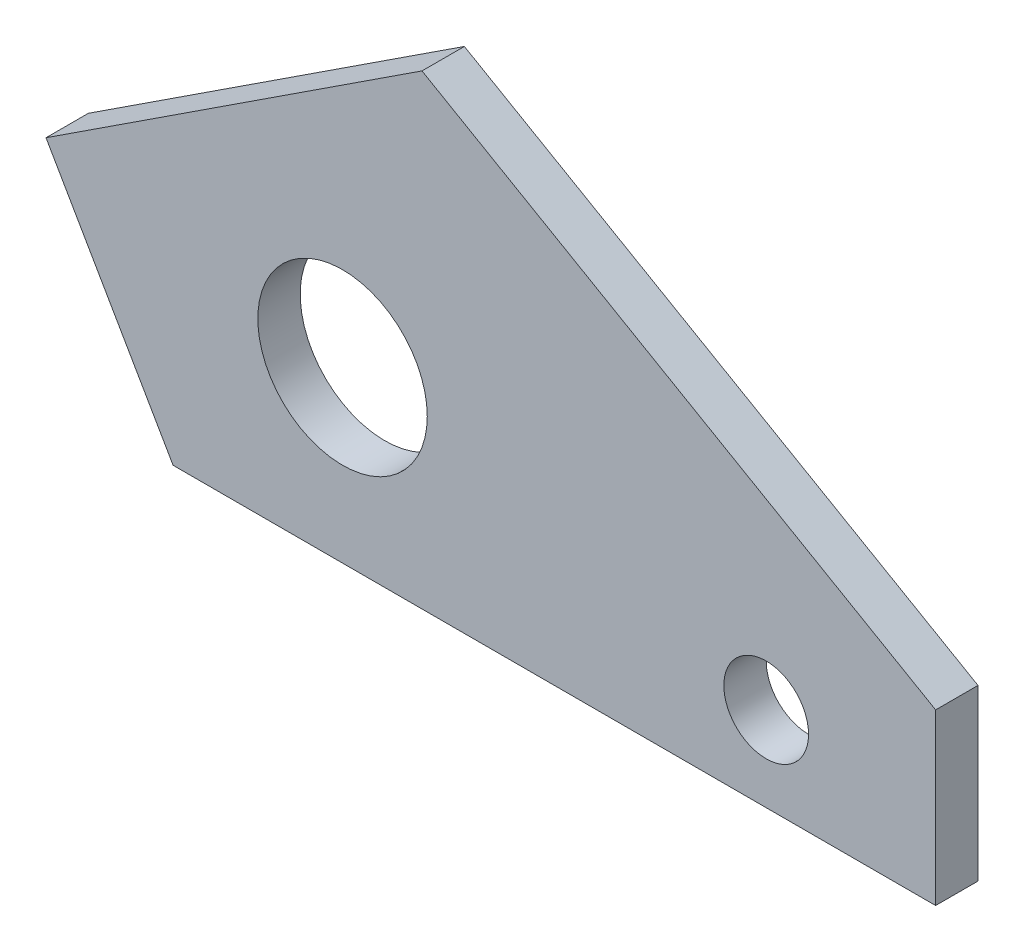
ISO-10303-21;
HEADER;
FILE_DESCRIPTION(('STEP AP214'),'2;1');
FILE_NAME('part.step','',(''),(''),'','','');
FILE_SCHEMA(('AUTOMOTIVE_DESIGN { 1 0 10303 214 1 1 1 1 }'));
ENDSEC;
DATA;
#1=APPLICATION_CONTEXT('core data for automotive mechanical design processes');
#2=APPLICATION_PROTOCOL_DEFINITION('international standard','automotive_design',2000,#1);
#3=PRODUCT_CONTEXT('',#1,'mechanical');
#4=PRODUCT('Part','Part','',(#3));
#5=PRODUCT_RELATED_PRODUCT_CATEGORY('part','',(#4));
#6=PRODUCT_DEFINITION_FORMATION('','',#4);
#7=PRODUCT_DEFINITION_CONTEXT('part definition',#1,'design');
#8=PRODUCT_DEFINITION('design','',#6,#7);
#9=PRODUCT_DEFINITION_SHAPE('','',#8);
#10=(LENGTH_UNIT() NAMED_UNIT(*) SI_UNIT(.MILLI.,.METRE.));
#11=(NAMED_UNIT(*) PLANE_ANGLE_UNIT() SI_UNIT($,.RADIAN.));
#12=(NAMED_UNIT(*) SI_UNIT($,.STERADIAN.) SOLID_ANGLE_UNIT());
#13=UNCERTAINTY_MEASURE_WITH_UNIT(LENGTH_MEASURE(1.E-05),#10,'distance_accuracy_value','');
#14=(GEOMETRIC_REPRESENTATION_CONTEXT(3) GLOBAL_UNCERTAINTY_ASSIGNED_CONTEXT((#13)) GLOBAL_UNIT_ASSIGNED_CONTEXT((#10,
#11,#12)) REPRESENTATION_CONTEXT('',''));
#15=CARTESIAN_POINT('',(0.,0.,0.));
#16=DIRECTION('',(0.,0.,1.));
#17=DIRECTION('',(1.,0.,0.));
#18=AXIS2_PLACEMENT_3D('',#15,#16,#17);
#19=CARTESIAN_POINT('',(-116.815158924205,0.,6.35));
#20=DIRECTION('',(-0.86602540378444,-0.499999999999998,0.));
#21=DIRECTION('',(0.499999999999998,-0.86602540378444,0.));
#22=AXIS2_PLACEMENT_3D('',#19,#20,#21);
#23=PLANE('',#22);
#24=DIRECTION('',(-0.499999999999998,0.86602540378444,0.));
#25=VECTOR('',#24,1.);
#26=CARTESIAN_POINT('',(-116.815158924205,0.,0.));
#27=LINE('',#26,#25);
#28=CARTESIAN_POINT('',(-116.815158924205,0.,0.));
#29=VERTEX_POINT('',#28);
#30=CARTESIAN_POINT('',(-135.865158924205,32.9955678841871,0.));
#31=VERTEX_POINT('',#30);
#32=EDGE_CURVE('E122',#29,#31,#27,.T.);
#33=ORIENTED_EDGE('',*,*,#32,.F.);
#34=DIRECTION('',(0.,0.,-1.));
#35=VECTOR('',#34,1.);
#36=CARTESIAN_POINT('',(-116.815158924205,0.,6.35));
#37=LINE('',#36,#35);
#38=CARTESIAN_POINT('',(-116.815158924205,0.,6.35));
#39=VERTEX_POINT('',#38);
#40=EDGE_CURVE('E11',#39,#29,#37,.T.);
#41=ORIENTED_EDGE('',*,*,#40,.F.);
#42=DIRECTION('',(-0.499999999999998,0.86602540378444,0.));
#43=VECTOR('',#42,1.);
#44=CARTESIAN_POINT('',(-116.815158924205,0.,6.35));
#45=LINE('',#44,#43);
#46=CARTESIAN_POINT('',(-135.865158924205,32.9955678841871,6.35));
#47=VERTEX_POINT('',#46);
#48=EDGE_CURVE('E116',#39,#47,#45,.T.);
#49=ORIENTED_EDGE('',*,*,#48,.T.);
#50=DIRECTION('',(0.,0.,-1.));
#51=VECTOR('',#50,1.);
#52=CARTESIAN_POINT('',(-135.865158924205,32.9955678841871,6.35));
#53=LINE('',#52,#51);
#54=EDGE_CURVE('E42',#47,#31,#53,.T.);
#55=ORIENTED_EDGE('',*,*,#54,.T.);
#56=EDGE_LOOP('',(#33,#41,#49,#55));
#57=FACE_BOUND('',#56,.T.);
#58=ADVANCED_FACE('F39',(#57),#23,.T.);
#59=CARTESIAN_POINT('',(-2.51515892420535,0.,6.35));
#60=DIRECTION('',(0.,-1.,0.));
#61=DIRECTION('',(0.,0.,-1.));
#62=AXIS2_PLACEMENT_3D('',#59,#60,#61);
#63=PLANE('',#62);
#64=DIRECTION('',(-1.,0.,0.));
#65=VECTOR('',#64,1.);
#66=CARTESIAN_POINT('',(-2.51515892420535,0.,0.));
#67=LINE('',#66,#65);
#68=CARTESIAN_POINT('',(-2.51515892420535,0.,0.));
#69=VERTEX_POINT('',#68);
#70=EDGE_CURVE('E136',#69,#29,#67,.T.);
#71=ORIENTED_EDGE('',*,*,#70,.F.);
#72=DIRECTION('',(0.,0.,-1.));
#73=VECTOR('',#72,1.);
#74=CARTESIAN_POINT('',(-2.51515892420535,0.,6.35));
#75=LINE('',#74,#73);
#76=CARTESIAN_POINT('',(-2.51515892420535,0.,6.35));
#77=VERTEX_POINT('',#76);
#78=EDGE_CURVE('E49',#77,#69,#75,.T.);
#79=ORIENTED_EDGE('',*,*,#78,.F.);
#80=DIRECTION('',(-1.,0.,0.));
#81=VECTOR('',#80,1.);
#82=CARTESIAN_POINT('',(-2.51515892420535,0.,6.35));
#83=LINE('',#82,#81);
#84=EDGE_CURVE('E108',#77,#39,#83,.T.);
#85=ORIENTED_EDGE('',*,*,#84,.T.);
#86=ORIENTED_EDGE('',*,*,#40,.T.);
#87=EDGE_LOOP('',(#71,#79,#85,#86));
#88=FACE_BOUND('',#87,.T.);
#89=ADVANCED_FACE('F146',(#88),#63,.T.);
#90=CARTESIAN_POINT('',(-2.51515892420536,25.4,6.35));
#91=DIRECTION('',(1.,0.,0.));
#92=DIRECTION('',(0.,1.,0.));
#93=AXIS2_PLACEMENT_3D('',#90,#91,#92);
#94=PLANE('',#93);
#95=DIRECTION('',(0.,-1.,0.));
#96=VECTOR('',#95,1.);
#97=CARTESIAN_POINT('',(-2.51515892420536,25.4,0.));
#98=LINE('',#97,#96);
#99=CARTESIAN_POINT('',(-2.51515892420536,25.4,0.));
#100=VERTEX_POINT('',#99);
#101=EDGE_CURVE('E96',#100,#69,#98,.T.);
#102=ORIENTED_EDGE('',*,*,#101,.F.);
#103=DIRECTION('',(0.,0.,-1.));
#104=VECTOR('',#103,1.);
#105=CARTESIAN_POINT('',(-2.51515892420536,25.4,6.35));
#106=LINE('',#105,#104);
#107=CARTESIAN_POINT('',(-2.51515892420536,25.4,6.35));
#108=VERTEX_POINT('',#107);
#109=EDGE_CURVE('E91',#108,#100,#106,.T.);
#110=ORIENTED_EDGE('',*,*,#109,.F.);
#111=DIRECTION('',(0.,-1.,0.));
#112=VECTOR('',#111,1.);
#113=CARTESIAN_POINT('',(-2.51515892420536,25.4,6.35));
#114=LINE('',#113,#112);
#115=EDGE_CURVE('E94',#108,#77,#114,.T.);
#116=ORIENTED_EDGE('',*,*,#115,.T.);
#117=ORIENTED_EDGE('',*,*,#78,.T.);
#118=EDGE_LOOP('',(#102,#110,#116,#117));
#119=FACE_BOUND('',#118,.T.);
#120=ADVANCED_FACE('F93',(#119),#94,.T.);
#121=CARTESIAN_POINT('',(-79.5048173206417,69.8500000000003,6.35));
#122=DIRECTION('',(0.500000000000004,0.866025403784436,0.));
#123=DIRECTION('',(-0.866025403784436,0.500000000000004,0.));
#124=AXIS2_PLACEMENT_3D('',#121,#122,#123);
#125=PLANE('',#124);
#126=DIRECTION('',(0.866025403784436,-0.500000000000004,0.));
#127=VECTOR('',#126,1.);
#128=CARTESIAN_POINT('',(-79.5048173206417,69.8500000000003,0.));
#129=LINE('',#128,#127);
#130=CARTESIAN_POINT('',(-79.5048173206417,69.8500000000003,0.));
#131=VERTEX_POINT('',#130);
#132=EDGE_CURVE('E131',#131,#100,#129,.T.);
#133=ORIENTED_EDGE('',*,*,#132,.F.);
#134=DIRECTION('',(0.,0.,-1.));
#135=VECTOR('',#134,1.);
#136=CARTESIAN_POINT('',(-79.5048173206417,69.8500000000003,6.35));
#137=LINE('',#136,#135);
#138=CARTESIAN_POINT('',(-79.5048173206417,69.8500000000003,6.35));
#139=VERTEX_POINT('',#138);
#140=EDGE_CURVE('E102',#139,#131,#137,.T.);
#141=ORIENTED_EDGE('',*,*,#140,.F.);
#142=DIRECTION('',(0.866025403784436,-0.500000000000004,0.));
#143=VECTOR('',#142,1.);
#144=CARTESIAN_POINT('',(-79.5048173206417,69.8500000000003,6.35));
#145=LINE('',#144,#143);
#146=EDGE_CURVE('E107',#139,#108,#145,.T.);
#147=ORIENTED_EDGE('',*,*,#146,.T.);
#148=ORIENTED_EDGE('',*,*,#109,.T.);
#149=EDGE_LOOP('',(#133,#141,#147,#148));
#150=FACE_BOUND('',#149,.T.);
#151=ADVANCED_FACE('F111',(#150),#125,.T.);
#152=CARTESIAN_POINT('',(-135.865158924205,32.9955678841871,6.35));
#153=DIRECTION('',(-0.547285142642468,0.836946218488866,0.));
#154=DIRECTION('',(-0.836946218488867,-0.547285142642468,0.));
#155=AXIS2_PLACEMENT_3D('',#152,#153,#154);
#156=PLANE('',#155);
#157=DIRECTION('',(0.836946218488867,0.547285142642468,0.));
#158=VECTOR('',#157,1.);
#159=CARTESIAN_POINT('',(-135.865158924205,32.9955678841871,0.));
#160=LINE('',#159,#158);
#161=EDGE_CURVE('E126',#31,#131,#160,.T.);
#162=ORIENTED_EDGE('',*,*,#161,.F.);
#163=ORIENTED_EDGE('',*,*,#54,.F.);
#164=DIRECTION('',(0.836946218488867,0.547285142642468,0.));
#165=VECTOR('',#164,1.);
#166=CARTESIAN_POINT('',(-135.865158924205,32.9955678841871,6.35));
#167=LINE('',#166,#165);
#168=EDGE_CURVE('E113',#47,#139,#167,.T.);
#169=ORIENTED_EDGE('',*,*,#168,.T.);
#170=ORIENTED_EDGE('',*,*,#140,.T.);
#171=EDGE_LOOP('',(#162,#163,#169,#170));
#172=FACE_BOUND('',#171,.T.);
#173=ADVANCED_FACE('F143',(#172),#156,.T.);
#174=CARTESIAN_POINT('',(0.,0.,6.35));
#175=DIRECTION('',(0.,0.,-1.));
#176=DIRECTION('',(-1.,0.,0.));
#177=AXIS2_PLACEMENT_3D('',#174,#175,#176);
#178=PLANE('',#177);
#179=CARTESIAN_POINT('',(-91.4151589242053,25.4,6.35));
#180=DIRECTION('',(0.,0.,1.));
#181=DIRECTION('',(1.,0.,0.));
#182=AXIS2_PLACEMENT_3D('',#179,#180,#181);
#183=CIRCLE('',#182,12.7);
#184=CARTESIAN_POINT('',(-78.7151589242053,25.4,6.35));
#185=VERTEX_POINT('',#184);
#186=EDGE_CURVE('E183',#185,#185,#183,.T.);
#187=ORIENTED_EDGE('',*,*,#186,.F.);
#188=EDGE_LOOP('',(#187));
#189=FACE_BOUND('',#188,.T.);
#190=CARTESIAN_POINT('',(-27.9151589242054,12.7,6.35));
#191=DIRECTION('',(0.,0.,1.));
#192=DIRECTION('',(1.,0.,0.));
#193=AXIS2_PLACEMENT_3D('',#190,#191,#192);
#194=CIRCLE('',#193,6.35);
#195=CARTESIAN_POINT('',(-21.5651589242054,12.7,6.35));
#196=VERTEX_POINT('',#195);
#197=EDGE_CURVE('E191',#196,#196,#194,.T.);
#198=ORIENTED_EDGE('',*,*,#197,.F.);
#199=EDGE_LOOP('',(#198));
#200=FACE_BOUND('',#199,.T.);
#201=ORIENTED_EDGE('',*,*,#48,.F.);
#202=ORIENTED_EDGE('',*,*,#84,.F.);
#203=ORIENTED_EDGE('',*,*,#115,.F.);
#204=ORIENTED_EDGE('',*,*,#146,.F.);
#205=ORIENTED_EDGE('',*,*,#168,.F.);
#206=EDGE_LOOP('',(#201,#202,#203,#204,#205));
#207=FACE_BOUND('',#206,.T.);
#208=ADVANCED_FACE('F106',(#189,#200,#207),#178,.F.);
#209=CARTESIAN_POINT('',(0.,0.,0.));
#210=DIRECTION('',(0.,0.,-1.));
#211=DIRECTION('',(-1.,0.,0.));
#212=AXIS2_PLACEMENT_3D('',#209,#210,#211);
#213=PLANE('',#212);
#214=CARTESIAN_POINT('',(-91.4151589242053,25.4,0.));
#215=DIRECTION('',(0.,0.,1.));
#216=DIRECTION('',(1.,0.,0.));
#217=AXIS2_PLACEMENT_3D('',#214,#215,#216);
#218=CIRCLE('',#217,12.7);
#219=CARTESIAN_POINT('',(-78.7151589242053,25.4,0.));
#220=VERTEX_POINT('',#219);
#221=EDGE_CURVE('E127',#220,#220,#218,.T.);
#222=ORIENTED_EDGE('',*,*,#221,.T.);
#223=EDGE_LOOP('',(#222));
#224=FACE_BOUND('',#223,.T.);
#225=CARTESIAN_POINT('',(-27.9151589242054,12.7,0.));
#226=DIRECTION('',(0.,0.,1.));
#227=DIRECTION('',(1.,0.,0.));
#228=AXIS2_PLACEMENT_3D('',#225,#226,#227);
#229=CIRCLE('',#228,6.35);
#230=CARTESIAN_POINT('',(-21.5651589242054,12.7,0.));
#231=VERTEX_POINT('',#230);
#232=EDGE_CURVE('E185',#231,#231,#229,.T.);
#233=ORIENTED_EDGE('',*,*,#232,.T.);
#234=EDGE_LOOP('',(#233));
#235=FACE_BOUND('',#234,.T.);
#236=ORIENTED_EDGE('',*,*,#32,.T.);
#237=ORIENTED_EDGE('',*,*,#161,.T.);
#238=ORIENTED_EDGE('',*,*,#132,.T.);
#239=ORIENTED_EDGE('',*,*,#101,.T.);
#240=ORIENTED_EDGE('',*,*,#70,.T.);
#241=EDGE_LOOP('',(#236,#237,#238,#239,#240));
#242=FACE_BOUND('',#241,.T.);
#243=ADVANCED_FACE('F145',(#224,#235,#242),#213,.T.);
#244=CARTESIAN_POINT('',(-27.9151589242054,12.7,0.));
#245=DIRECTION('',(0.,0.,1.));
#246=DIRECTION('',(1.,0.,0.));
#247=AXIS2_PLACEMENT_3D('',#244,#245,#246);
#248=CYLINDRICAL_SURFACE('',#247,6.35);
#249=ORIENTED_EDGE('',*,*,#232,.F.);
#250=EDGE_LOOP('',(#249));
#251=FACE_BOUND('',#250,.T.);
#252=ORIENTED_EDGE('',*,*,#197,.T.);
#253=EDGE_LOOP('',(#252));
#254=FACE_BOUND('',#253,.T.);
#255=ADVANCED_FACE('F166',(#251,#254),#248,.F.);
#256=CARTESIAN_POINT('',(-91.4151589242053,25.4,0.));
#257=DIRECTION('',(0.,0.,1.));
#258=DIRECTION('',(1.,0.,0.));
#259=AXIS2_PLACEMENT_3D('',#256,#257,#258);
#260=CYLINDRICAL_SURFACE('',#259,12.7);
#261=ORIENTED_EDGE('',*,*,#221,.F.);
#262=EDGE_LOOP('',(#261));
#263=FACE_BOUND('',#262,.T.);
#264=ORIENTED_EDGE('',*,*,#186,.T.);
#265=EDGE_LOOP('',(#264));
#266=FACE_BOUND('',#265,.T.);
#267=ADVANCED_FACE('F173',(#263,#266),#260,.F.);
#268=CLOSED_SHELL('',(#58,#89,#120,#151,#173,#208,#243,#255,#267));
#269=MANIFOLD_SOLID_BREP('B2',#268);
#270=ADVANCED_BREP_SHAPE_REPRESENTATION('',(#18,#269),#14);
#271=SHAPE_DEFINITION_REPRESENTATION(#9,#270);
ENDSEC;
END-ISO-10303-21;
